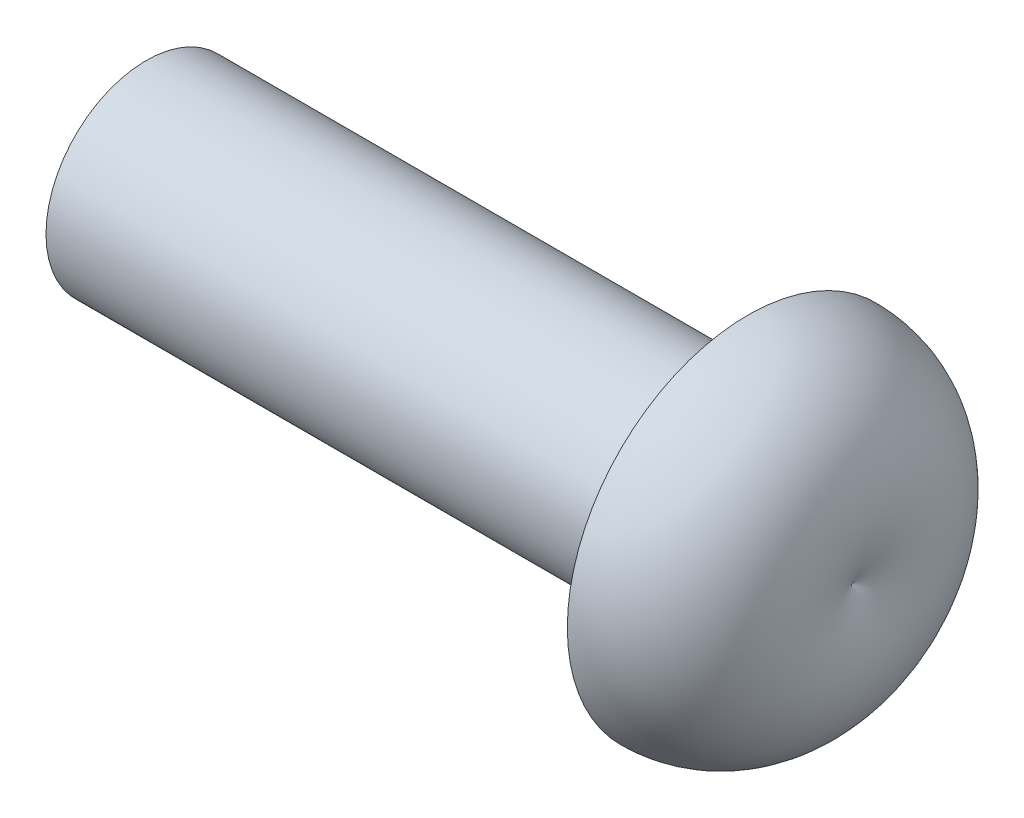
ISO-10303-21;
HEADER;
FILE_DESCRIPTION(('STEP AP214'),'2;1');
FILE_NAME('part.step','',(''),(''),'','','');
FILE_SCHEMA(('AUTOMOTIVE_DESIGN { 1 0 10303 214 1 1 1 1 }'));
ENDSEC;
DATA;
#1=APPLICATION_CONTEXT('core data for automotive mechanical design processes');
#2=APPLICATION_PROTOCOL_DEFINITION('international standard','automotive_design',2000,#1);
#3=PRODUCT_CONTEXT('',#1,'mechanical');
#4=PRODUCT('Part','Part','',(#3));
#5=PRODUCT_RELATED_PRODUCT_CATEGORY('part','',(#4));
#6=PRODUCT_DEFINITION_FORMATION('','',#4);
#7=PRODUCT_DEFINITION_CONTEXT('part definition',#1,'design');
#8=PRODUCT_DEFINITION('design','',#6,#7);
#9=PRODUCT_DEFINITION_SHAPE('','',#8);
#10=(LENGTH_UNIT() NAMED_UNIT(*) SI_UNIT(.MILLI.,.METRE.));
#11=(NAMED_UNIT(*) PLANE_ANGLE_UNIT() SI_UNIT($,.RADIAN.));
#12=(NAMED_UNIT(*) SI_UNIT($,.STERADIAN.) SOLID_ANGLE_UNIT());
#13=UNCERTAINTY_MEASURE_WITH_UNIT(LENGTH_MEASURE(1.E-05),#10,'distance_accuracy_value','');
#14=(GEOMETRIC_REPRESENTATION_CONTEXT(3) GLOBAL_UNCERTAINTY_ASSIGNED_CONTEXT((#13)) GLOBAL_UNIT_ASSIGNED_CONTEXT((#10,
#11,#12)) REPRESENTATION_CONTEXT('',''));
#15=CARTESIAN_POINT('',(0.,0.,0.));
#16=DIRECTION('',(0.,0.,1.));
#17=DIRECTION('',(1.,0.,0.));
#18=AXIS2_PLACEMENT_3D('',#15,#16,#17);
#19=CARTESIAN_POINT('',(-15.,0.,0.));
#20=DIRECTION('',(1.,0.,0.));
#21=DIRECTION('',(0.,0.,-1.));
#22=AXIS2_PLACEMENT_3D('',#19,#20,#21);
#23=PLANE('',#22);
#24=CARTESIAN_POINT('',(-15.,-2.5,0.));
#25=DIRECTION('',(-1.,0.,0.));
#26=DIRECTION('',(0.,0.,1.));
#27=AXIS2_PLACEMENT_3D('',#24,#25,#26);
#28=CIRCLE('',#27,2.5);
#29=CARTESIAN_POINT('',(-15.,-2.5,2.5));
#30=VERTEX_POINT('',#29);
#31=EDGE_CURVE('E11',#30,#30,#28,.T.);
#32=ORIENTED_EDGE('',*,*,#31,.T.);
#33=EDGE_LOOP('',(#32));
#34=FACE_BOUND('',#33,.T.);
#35=ADVANCED_FACE('F37',(#34),#23,.F.);
#36=CARTESIAN_POINT('',(-16.3869167359536,-2.5,0.));
#37=DIRECTION('',(-1.,0.,0.));
#38=DIRECTION('',(0.,0.,1.));
#39=AXIS2_PLACEMENT_3D('',#36,#37,#38);
#40=CYLINDRICAL_SURFACE('',#39,2.5);
#41=ORIENTED_EDGE('',*,*,#31,.F.);
#42=EDGE_LOOP('',(#41));
#43=FACE_BOUND('',#42,.T.);
#44=CARTESIAN_POINT('',(0.,-2.5,0.));
#45=DIRECTION('',(-1.,0.,0.));
#46=DIRECTION('',(0.,0.,1.));
#47=AXIS2_PLACEMENT_3D('',#44,#45,#46);
#48=CIRCLE('',#47,2.5);
#49=CARTESIAN_POINT('',(0.,-2.5,2.5));
#50=VERTEX_POINT('',#49);
#51=EDGE_CURVE('E43',#50,#50,#48,.T.);
#52=ORIENTED_EDGE('',*,*,#51,.T.);
#53=EDGE_LOOP('',(#52));
#54=FACE_BOUND('',#53,.T.);
#55=ADVANCED_FACE('F54',(#43,#54),#40,.T.);
#56=CARTESIAN_POINT('',(0.,0.,0.));
#57=DIRECTION('',(1.,0.,0.));
#58=DIRECTION('',(0.,0.,-1.));
#59=AXIS2_PLACEMENT_3D('',#56,#57,#58);
#60=PLANE('',#59);
#61=ORIENTED_EDGE('',*,*,#51,.F.);
#62=EDGE_LOOP('',(#61));
#63=FACE_BOUND('',#62,.T.);
#64=CARTESIAN_POINT('',(0.,-2.5,0.));
#65=DIRECTION('',(-1.,0.,0.));
#66=DIRECTION('',(0.,0.,1.));
#67=AXIS2_PLACEMENT_3D('',#64,#65,#66);
#68=CIRCLE('',#67,4.5);
#69=CARTESIAN_POINT('',(0.,-2.5,4.5));
#70=VERTEX_POINT('',#69);
#71=EDGE_CURVE('E68',#70,#70,#68,.T.);
#72=ORIENTED_EDGE('',*,*,#71,.T.);
#73=EDGE_LOOP('',(#72));
#74=FACE_BOUND('',#73,.T.);
#75=ADVANCED_FACE('F48',(#63,#74),#60,.F.);
#76=CARTESIAN_POINT('',(0.,-2.5,1.5));
#77=DIRECTION('',(0.,-1.,0.));
#78=DIRECTION('',(0.,0.,1.));
#79=AXIS2_PLACEMENT_3D('',#76,#77,#78);
#80=CIRCLE('',#79,3.);
#81=TRIMMED_CURVE('',#80,(PARAMETER_VALUE(-2.0943951023932)),(PARAMETER_VALUE(2.0943951023932)),
.T.,.PARAMETER.);
#82=CARTESIAN_POINT('',(0.,-2.5,0.));
#83=DIRECTION('',(-1.,0.,0.));
#84=AXIS1_PLACEMENT('',#82,#83);
#85=SURFACE_OF_REVOLUTION('',#81,#84);
#86=ORIENTED_EDGE('',*,*,#71,.F.);
#87=EDGE_LOOP('',(#86));
#88=FACE_BOUND('',#87,.T.);
#89=CARTESIAN_POINT('',(2.59807621135332,-2.5,0.));
#90=VERTEX_POINT('',#89);
#91=VERTEX_LOOP('',#90);
#92=FACE_BOUND('',#91,.T.);
#93=ADVANCED_FACE('F46',(#88,#92),#85,.T.);
#94=CLOSED_SHELL('',(#35,#55,#75,#93));
#95=MANIFOLD_SOLID_BREP('B2',#94);
#96=ADVANCED_BREP_SHAPE_REPRESENTATION('',(#18,#95),#14);
#97=SHAPE_DEFINITION_REPRESENTATION(#9,#96);
ENDSEC;
END-ISO-10303-21;
